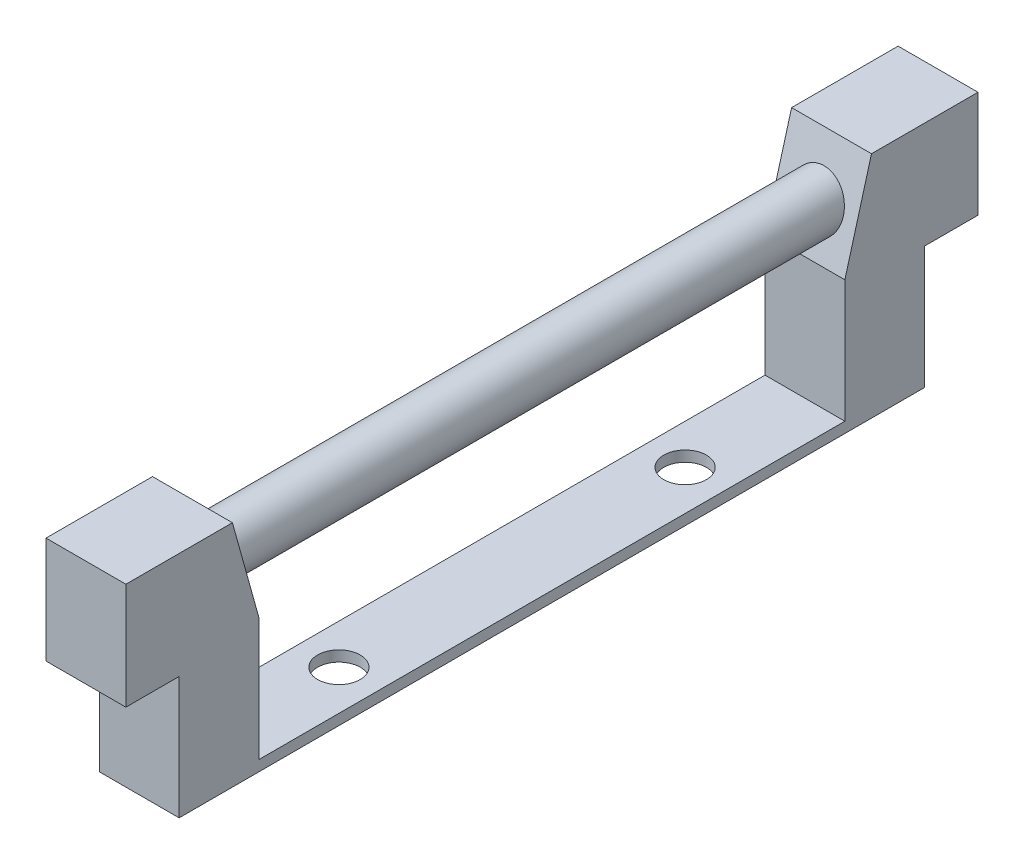
ISO-10303-21;
HEADER;
FILE_DESCRIPTION(('STEP AP214'),'2;1');
FILE_NAME('part.step','',(''),(''),'','','');
FILE_SCHEMA(('AUTOMOTIVE_DESIGN { 1 0 10303 214 1 1 1 1 }'));
ENDSEC;
DATA;
#1=APPLICATION_CONTEXT('core data for automotive mechanical design processes');
#2=APPLICATION_PROTOCOL_DEFINITION('international standard','automotive_design',2000,#1);
#3=PRODUCT_CONTEXT('',#1,'mechanical');
#4=PRODUCT('Part','Part','',(#3));
#5=PRODUCT_RELATED_PRODUCT_CATEGORY('part','',(#4));
#6=PRODUCT_DEFINITION_FORMATION('','',#4);
#7=PRODUCT_DEFINITION_CONTEXT('part definition',#1,'design');
#8=PRODUCT_DEFINITION('design','',#6,#7);
#9=PRODUCT_DEFINITION_SHAPE('','',#8);
#10=(LENGTH_UNIT() NAMED_UNIT(*) SI_UNIT(.MILLI.,.METRE.));
#11=(NAMED_UNIT(*) PLANE_ANGLE_UNIT() SI_UNIT($,.RADIAN.));
#12=(NAMED_UNIT(*) SI_UNIT($,.STERADIAN.) SOLID_ANGLE_UNIT());
#13=UNCERTAINTY_MEASURE_WITH_UNIT(LENGTH_MEASURE(1.E-05),#10,'distance_accuracy_value','');
#14=(GEOMETRIC_REPRESENTATION_CONTEXT(3) GLOBAL_UNCERTAINTY_ASSIGNED_CONTEXT((#13)) GLOBAL_UNIT_ASSIGNED_CONTEXT((#10,
#11,#12)) REPRESENTATION_CONTEXT('',''));
#15=CARTESIAN_POINT('',(0.,0.,0.));
#16=DIRECTION('',(0.,0.,1.));
#17=DIRECTION('',(1.,0.,0.));
#18=AXIS2_PLACEMENT_3D('',#15,#16,#17);
#19=CARTESIAN_POINT('',(-7.5,-43.,0.));
#20=DIRECTION('',(0.,-1.,0.));
#21=DIRECTION('',(0.,0.,-1.));
#22=AXIS2_PLACEMENT_3D('',#19,#20,#21);
#23=PLANE('',#22);
#24=CARTESIAN_POINT('',(0.,-43.,-32.5));
#25=DIRECTION('',(0.,-1.,0.));
#26=DIRECTION('',(0.,0.,-1.));
#27=AXIS2_PLACEMENT_3D('',#24,#25,#26);
#28=CIRCLE('',#27,4.);
#29=CARTESIAN_POINT('',(0.,-43.,-36.5));
#30=VERTEX_POINT('',#29);
#31=EDGE_CURVE('E356',#30,#30,#28,.T.);
#32=ORIENTED_EDGE('',*,*,#31,.F.);
#33=EDGE_LOOP('',(#32));
#34=FACE_BOUND('',#33,.T.);
#35=CARTESIAN_POINT('',(0.,-43.,32.5));
#36=DIRECTION('',(0.,-1.,0.));
#37=DIRECTION('',(0.,0.,-1.));
#38=AXIS2_PLACEMENT_3D('',#35,#36,#37);
#39=CIRCLE('',#38,4.);
#40=CARTESIAN_POINT('',(0.,-43.,28.5));
#41=VERTEX_POINT('',#40);
#42=EDGE_CURVE('E360',#41,#41,#39,.T.);
#43=ORIENTED_EDGE('',*,*,#42,.F.);
#44=EDGE_LOOP('',(#43));
#45=FACE_BOUND('',#44,.T.);
#46=DIRECTION('',(1.,0.,0.));
#47=VECTOR('',#46,1.);
#48=CARTESIAN_POINT('',(-7.5,-43.,-70.));
#49=LINE('',#48,#47);
#50=CARTESIAN_POINT('',(-7.5,-43.,-70.));
#51=VERTEX_POINT('',#50);
#52=CARTESIAN_POINT('',(7.5,-43.,-70.));
#53=VERTEX_POINT('',#52);
#54=EDGE_CURVE('E136',#51,#53,#49,.T.);
#55=ORIENTED_EDGE('',*,*,#54,.T.);
#56=DIRECTION('',(0.,0.,-1.));
#57=VECTOR('',#56,1.);
#58=CARTESIAN_POINT('',(7.5,-43.,0.));
#59=LINE('',#58,#57);
#60=CARTESIAN_POINT('',(7.5,-43.,70.));
#61=VERTEX_POINT('',#60);
#62=EDGE_CURVE('E138',#61,#53,#59,.T.);
#63=ORIENTED_EDGE('',*,*,#62,.F.);
#64=DIRECTION('',(1.,0.,0.));
#65=VECTOR('',#64,1.);
#66=CARTESIAN_POINT('',(-7.5,-43.,70.));
#67=LINE('',#66,#65);
#68=CARTESIAN_POINT('',(-7.5,-43.,70.));
#69=VERTEX_POINT('',#68);
#70=EDGE_CURVE('E44',#69,#61,#67,.T.);
#71=ORIENTED_EDGE('',*,*,#70,.F.);
#72=DIRECTION('',(0.,0.,-1.));
#73=VECTOR('',#72,1.);
#74=CARTESIAN_POINT('',(-7.5,-43.,0.));
#75=LINE('',#74,#73);
#76=EDGE_CURVE('E139',#69,#51,#75,.T.);
#77=ORIENTED_EDGE('',*,*,#76,.T.);
#78=EDGE_LOOP('',(#55,#63,#71,#77));
#79=FACE_BOUND('',#78,.T.);
#80=ADVANCED_FACE('F37',(#34,#45,#79),#23,.T.);
#81=CARTESIAN_POINT('',(-7.5,0.,70.));
#82=DIRECTION('',(0.,0.,1.));
#83=DIRECTION('',(1.,0.,0.));
#84=AXIS2_PLACEMENT_3D('',#81,#82,#83);
#85=PLANE('',#84);
#86=ORIENTED_EDGE('',*,*,#70,.T.);
#87=DIRECTION('',(0.,-1.,0.));
#88=VECTOR('',#87,1.);
#89=CARTESIAN_POINT('',(7.5,0.,70.));
#90=LINE('',#89,#88);
#91=CARTESIAN_POINT('',(7.5,-20.,70.));
#92=VERTEX_POINT('',#91);
#93=EDGE_CURVE('E153',#92,#61,#90,.T.);
#94=ORIENTED_EDGE('',*,*,#93,.F.);
#95=DIRECTION('',(1.,0.,0.));
#96=VECTOR('',#95,1.);
#97=CARTESIAN_POINT('',(-7.5,-20.,70.));
#98=LINE('',#97,#96);
#99=CARTESIAN_POINT('',(-7.5,-20.,70.));
#100=VERTEX_POINT('',#99);
#101=EDGE_CURVE('E58',#100,#92,#98,.T.);
#102=ORIENTED_EDGE('',*,*,#101,.F.);
#103=DIRECTION('',(0.,-1.,0.));
#104=VECTOR('',#103,1.);
#105=CARTESIAN_POINT('',(-7.5,0.,70.));
#106=LINE('',#105,#104);
#107=EDGE_CURVE('E144',#100,#69,#106,.T.);
#108=ORIENTED_EDGE('',*,*,#107,.T.);
#109=EDGE_LOOP('',(#86,#94,#102,#108));
#110=FACE_BOUND('',#109,.T.);
#111=ADVANCED_FACE('F296',(#110),#85,.T.);
#112=CARTESIAN_POINT('',(-7.5,-20.,0.));
#113=DIRECTION('',(0.,-1.,0.));
#114=DIRECTION('',(0.,0.,-1.));
#115=AXIS2_PLACEMENT_3D('',#112,#113,#114);
#116=PLANE('',#115);
#117=ORIENTED_EDGE('',*,*,#101,.T.);
#118=DIRECTION('',(0.,0.,-1.));
#119=VECTOR('',#118,1.);
#120=CARTESIAN_POINT('',(7.5,-20.,0.));
#121=LINE('',#120,#119);
#122=CARTESIAN_POINT('',(7.5,-20.,80.));
#123=VERTEX_POINT('',#122);
#124=EDGE_CURVE('E190',#123,#92,#121,.T.);
#125=ORIENTED_EDGE('',*,*,#124,.F.);
#126=DIRECTION('',(1.,0.,0.));
#127=VECTOR('',#126,1.);
#128=CARTESIAN_POINT('',(-7.5,-20.,80.));
#129=LINE('',#128,#127);
#130=CARTESIAN_POINT('',(-7.5,-20.,80.));
#131=VERTEX_POINT('',#130);
#132=EDGE_CURVE('E225',#131,#123,#129,.T.);
#133=ORIENTED_EDGE('',*,*,#132,.F.);
#134=DIRECTION('',(0.,0.,-1.));
#135=VECTOR('',#134,1.);
#136=CARTESIAN_POINT('',(-7.5,-20.,0.));
#137=LINE('',#136,#135);
#138=EDGE_CURVE('E220',#131,#100,#137,.T.);
#139=ORIENTED_EDGE('',*,*,#138,.T.);
#140=EDGE_LOOP('',(#117,#125,#133,#139));
#141=FACE_BOUND('',#140,.T.);
#142=ADVANCED_FACE('F295',(#141),#116,.T.);
#143=CARTESIAN_POINT('',(-7.5,0.,80.));
#144=DIRECTION('',(0.,0.,1.));
#145=DIRECTION('',(1.,0.,0.));
#146=AXIS2_PLACEMENT_3D('',#143,#144,#145);
#147=PLANE('',#146);
#148=ORIENTED_EDGE('',*,*,#132,.T.);
#149=DIRECTION('',(0.,-1.,0.));
#150=VECTOR('',#149,1.);
#151=CARTESIAN_POINT('',(7.5,0.,80.));
#152=LINE('',#151,#150);
#153=CARTESIAN_POINT('',(7.5,0.,80.));
#154=VERTEX_POINT('',#153);
#155=EDGE_CURVE('E187',#154,#123,#152,.T.);
#156=ORIENTED_EDGE('',*,*,#155,.F.);
#157=DIRECTION('',(1.,0.,0.));
#158=VECTOR('',#157,1.);
#159=CARTESIAN_POINT('',(-7.5,0.,80.));
#160=LINE('',#159,#158);
#161=CARTESIAN_POINT('',(-7.5,0.,80.));
#162=VERTEX_POINT('',#161);
#163=EDGE_CURVE('E227',#162,#154,#160,.T.);
#164=ORIENTED_EDGE('',*,*,#163,.F.);
#165=DIRECTION('',(0.,-1.,0.));
#166=VECTOR('',#165,1.);
#167=CARTESIAN_POINT('',(-7.5,0.,80.));
#168=LINE('',#167,#166);
#169=EDGE_CURVE('E217',#162,#131,#168,.T.);
#170=ORIENTED_EDGE('',*,*,#169,.T.);
#171=EDGE_LOOP('',(#148,#156,#164,#170));
#172=FACE_BOUND('',#171,.T.);
#173=ADVANCED_FACE('F291',(#172),#147,.T.);
#174=CARTESIAN_POINT('',(-7.5,0.,0.));
#175=DIRECTION('',(0.,1.,0.));
#176=DIRECTION('',(0.,0.,1.));
#177=AXIS2_PLACEMENT_3D('',#174,#175,#176);
#178=PLANE('',#177);
#179=ORIENTED_EDGE('',*,*,#163,.T.);
#180=DIRECTION('',(0.,0.,1.));
#181=VECTOR('',#180,1.);
#182=CARTESIAN_POINT('',(7.5,0.,0.));
#183=LINE('',#182,#181);
#184=CARTESIAN_POINT('',(7.5,0.,60.));
#185=VERTEX_POINT('',#184);
#186=EDGE_CURVE('E184',#185,#154,#183,.T.);
#187=ORIENTED_EDGE('',*,*,#186,.F.);
#188=DIRECTION('',(1.,0.,0.));
#189=VECTOR('',#188,1.);
#190=CARTESIAN_POINT('',(-7.5,0.,60.));
#191=LINE('',#190,#189);
#192=CARTESIAN_POINT('',(-7.5,0.,60.));
#193=VERTEX_POINT('',#192);
#194=EDGE_CURVE('E229',#193,#185,#191,.T.);
#195=ORIENTED_EDGE('',*,*,#194,.F.);
#196=DIRECTION('',(0.,0.,1.));
#197=VECTOR('',#196,1.);
#198=CARTESIAN_POINT('',(-7.5,0.,0.));
#199=LINE('',#198,#197);
#200=EDGE_CURVE('E214',#193,#162,#199,.T.);
#201=ORIENTED_EDGE('',*,*,#200,.T.);
#202=EDGE_LOOP('',(#179,#187,#195,#201));
#203=FACE_BOUND('',#202,.T.);
#204=ADVANCED_FACE('F284',(#203),#178,.T.);
#205=CARTESIAN_POINT('',(-7.5,-15.4727793696275,55.702005730659));
#206=DIRECTION('',(0.,0.267643863786094,-0.963517909629941));
#207=DIRECTION('',(0.,0.963517909629941,0.267643863786094));
#208=AXIS2_PLACEMENT_3D('',#205,#206,#207);
#209=PLANE('',#208);
#210=CARTESIAN_POINT('',(0.,-10.,57.2222222222222));
#211=DIRECTION('',(0.,0.267643863786094,-0.963517909629941));
#212=DIRECTION('',(0.,-0.963517909629941,-0.267643863786094));
#213=AXIS2_PLACEMENT_3D('',#210,#211,#212);
#214=ELLIPSE('',#213,5.1893171367415,5.);
#215=CARTESIAN_POINT('',(0.,-15.,55.8333333333333));
#216=VERTEX_POINT('',#215);
#217=EDGE_CURVE('E154',#216,#216,#214,.F.);
#218=ORIENTED_EDGE('',*,*,#217,.T.);
#219=EDGE_LOOP('',(#218));
#220=FACE_BOUND('',#219,.T.);
#221=ORIENTED_EDGE('',*,*,#194,.T.);
#222=DIRECTION('',(0.,0.963517909629941,0.267643863786094));
#223=VECTOR('',#222,1.);
#224=CARTESIAN_POINT('',(7.5,-15.4727793696275,55.702005730659));
#225=LINE('',#224,#223);
#226=CARTESIAN_POINT('',(7.5,-18.,55.));
#227=VERTEX_POINT('',#226);
#228=EDGE_CURVE('E181',#227,#185,#225,.T.);
#229=ORIENTED_EDGE('',*,*,#228,.F.);
#230=DIRECTION('',(1.,0.,0.));
#231=VECTOR('',#230,1.);
#232=CARTESIAN_POINT('',(-7.5,-18.,55.));
#233=LINE('',#232,#231);
#234=CARTESIAN_POINT('',(-7.5,-18.,55.));
#235=VERTEX_POINT('',#234);
#236=EDGE_CURVE('E231',#235,#227,#233,.T.);
#237=ORIENTED_EDGE('',*,*,#236,.F.);
#238=DIRECTION('',(0.,0.963517909629941,0.267643863786094));
#239=VECTOR('',#238,1.);
#240=CARTESIAN_POINT('',(-7.5,-15.4727793696275,55.702005730659));
#241=LINE('',#240,#239);
#242=EDGE_CURVE('E211',#235,#193,#241,.T.);
#243=ORIENTED_EDGE('',*,*,#242,.T.);
#244=EDGE_LOOP('',(#221,#229,#237,#243));
#245=FACE_BOUND('',#244,.T.);
#246=ADVANCED_FACE('F280',(#220,#245),#209,.T.);
#247=CARTESIAN_POINT('',(-7.5,0.,55.));
#248=DIRECTION('',(0.,0.,-1.));
#249=DIRECTION('',(-1.,0.,0.));
#250=AXIS2_PLACEMENT_3D('',#247,#248,#249);
#251=PLANE('',#250);
#252=ORIENTED_EDGE('',*,*,#236,.T.);
#253=DIRECTION('',(0.,1.,0.));
#254=VECTOR('',#253,1.);
#255=CARTESIAN_POINT('',(7.5,0.,55.));
#256=LINE('',#255,#254);
#257=CARTESIAN_POINT('',(7.5,-41.,55.));
#258=VERTEX_POINT('',#257);
#259=EDGE_CURVE('E178',#258,#227,#256,.T.);
#260=ORIENTED_EDGE('',*,*,#259,.F.);
#261=DIRECTION('',(1.,0.,0.));
#262=VECTOR('',#261,1.);
#263=CARTESIAN_POINT('',(-7.5,-41.,55.));
#264=LINE('',#263,#262);
#265=CARTESIAN_POINT('',(-7.5,-41.,55.));
#266=VERTEX_POINT('',#265);
#267=EDGE_CURVE('E233',#266,#258,#264,.T.);
#268=ORIENTED_EDGE('',*,*,#267,.F.);
#269=DIRECTION('',(0.,1.,0.));
#270=VECTOR('',#269,1.);
#271=CARTESIAN_POINT('',(-7.5,0.,55.));
#272=LINE('',#271,#270);
#273=EDGE_CURVE('E208',#266,#235,#272,.T.);
#274=ORIENTED_EDGE('',*,*,#273,.T.);
#275=EDGE_LOOP('',(#252,#260,#268,#274));
#276=FACE_BOUND('',#275,.T.);
#277=ADVANCED_FACE('F276',(#276),#251,.T.);
#278=CARTESIAN_POINT('',(-7.5,-41.,0.));
#279=DIRECTION('',(0.,-1.,0.));
#280=DIRECTION('',(0.,0.,-1.));
#281=AXIS2_PLACEMENT_3D('',#278,#279,#280);
#282=PLANE('',#281);
#283=CARTESIAN_POINT('',(0.,-41.,-32.5));
#284=DIRECTION('',(0.,1.,0.));
#285=DIRECTION('',(0.,0.,1.));
#286=AXIS2_PLACEMENT_3D('',#283,#284,#285);
#287=CIRCLE('',#286,4.);
#288=CARTESIAN_POINT('',(0.,-41.,-28.5));
#289=VERTEX_POINT('',#288);
#290=EDGE_CURVE('E359',#289,#289,#287,.T.);
#291=ORIENTED_EDGE('',*,*,#290,.F.);
#292=EDGE_LOOP('',(#291));
#293=FACE_BOUND('',#292,.T.);
#294=CARTESIAN_POINT('',(0.,-41.,32.5));
#295=DIRECTION('',(0.,1.,0.));
#296=DIRECTION('',(0.,0.,1.));
#297=AXIS2_PLACEMENT_3D('',#294,#295,#296);
#298=CIRCLE('',#297,4.);
#299=CARTESIAN_POINT('',(0.,-41.,36.5));
#300=VERTEX_POINT('',#299);
#301=EDGE_CURVE('E361',#300,#300,#298,.T.);
#302=ORIENTED_EDGE('',*,*,#301,.F.);
#303=EDGE_LOOP('',(#302));
#304=FACE_BOUND('',#303,.T.);
#305=ORIENTED_EDGE('',*,*,#267,.T.);
#306=DIRECTION('',(0.,0.,-1.));
#307=VECTOR('',#306,1.);
#308=CARTESIAN_POINT('',(7.5,-41.,0.));
#309=LINE('',#308,#307);
#310=CARTESIAN_POINT('',(7.5,-41.,-55.));
#311=VERTEX_POINT('',#310);
#312=EDGE_CURVE('E175',#258,#311,#309,.T.);
#313=ORIENTED_EDGE('',*,*,#312,.T.);
#314=DIRECTION('',(1.,0.,0.));
#315=VECTOR('',#314,1.);
#316=CARTESIAN_POINT('',(-7.5,-41.,-55.));
#317=LINE('',#316,#315);
#318=CARTESIAN_POINT('',(-7.5,-41.,-55.));
#319=VERTEX_POINT('',#318);
#320=EDGE_CURVE('E235',#319,#311,#317,.T.);
#321=ORIENTED_EDGE('',*,*,#320,.F.);
#322=DIRECTION('',(0.,0.,-1.));
#323=VECTOR('',#322,1.);
#324=CARTESIAN_POINT('',(-7.5,-41.,0.));
#325=LINE('',#324,#323);
#326=EDGE_CURVE('E206',#266,#319,#325,.T.);
#327=ORIENTED_EDGE('',*,*,#326,.F.);
#328=EDGE_LOOP('',(#305,#313,#321,#327));
#329=FACE_BOUND('',#328,.T.);
#330=ADVANCED_FACE('F271',(#293,#304,#329),#282,.F.);
#331=CARTESIAN_POINT('',(-7.5,0.,-55.));
#332=DIRECTION('',(0.,0.,-1.));
#333=DIRECTION('',(0.,1.,0.));
#334=AXIS2_PLACEMENT_3D('',#331,#332,#333);
#335=PLANE('',#334);
#336=ORIENTED_EDGE('',*,*,#320,.T.);
#337=DIRECTION('',(0.,1.,0.));
#338=VECTOR('',#337,1.);
#339=CARTESIAN_POINT('',(7.5,0.,-55.));
#340=LINE('',#339,#338);
#341=CARTESIAN_POINT('',(7.5,-18.,-55.));
#342=VERTEX_POINT('',#341);
#343=EDGE_CURVE('E172',#311,#342,#340,.T.);
#344=ORIENTED_EDGE('',*,*,#343,.T.);
#345=DIRECTION('',(1.,0.,0.));
#346=VECTOR('',#345,1.);
#347=CARTESIAN_POINT('',(-7.5,-18.,-55.));
#348=LINE('',#347,#346);
#349=CARTESIAN_POINT('',(-7.5,-18.,-55.));
#350=VERTEX_POINT('',#349);
#351=EDGE_CURVE('E237',#350,#342,#348,.T.);
#352=ORIENTED_EDGE('',*,*,#351,.F.);
#353=DIRECTION('',(0.,1.,0.));
#354=VECTOR('',#353,1.);
#355=CARTESIAN_POINT('',(-7.5,0.,-55.));
#356=LINE('',#355,#354);
#357=EDGE_CURVE('E204',#319,#350,#356,.T.);
#358=ORIENTED_EDGE('',*,*,#357,.F.);
#359=EDGE_LOOP('',(#336,#344,#352,#358));
#360=FACE_BOUND('',#359,.T.);
#361=ADVANCED_FACE('F267',(#360),#335,.F.);
#362=CARTESIAN_POINT('',(-7.5,-15.4727793696275,-55.702005730659));
#363=DIRECTION('',(0.,-0.267643863786094,-0.963517909629941));
#364=DIRECTION('',(0.,0.963517909629941,-0.267643863786094));
#365=AXIS2_PLACEMENT_3D('',#362,#363,#364);
#366=PLANE('',#365);
#367=CARTESIAN_POINT('',(0.,-10.,-57.2222222222222));
#368=DIRECTION('',(0.,-0.267643863786094,-0.963517909629941));
#369=DIRECTION('',(0.,0.963517909629941,-0.267643863786094));
#370=AXIS2_PLACEMENT_3D('',#367,#368,#369);
#371=ELLIPSE('',#370,5.1893171367415,5.);
#372=CARTESIAN_POINT('',(0.,-5.,-58.6111111111111));
#373=VERTEX_POINT('',#372);
#374=EDGE_CURVE('E11',#373,#373,#371,.F.);
#375=ORIENTED_EDGE('',*,*,#374,.F.);
#376=EDGE_LOOP('',(#375));
#377=FACE_BOUND('',#376,.T.);
#378=ORIENTED_EDGE('',*,*,#351,.T.);
#379=DIRECTION('',(0.,0.963517909629941,-0.267643863786094));
#380=VECTOR('',#379,1.);
#381=CARTESIAN_POINT('',(7.5,-15.4727793696275,-55.702005730659));
#382=LINE('',#381,#380);
#383=CARTESIAN_POINT('',(7.5,0.,-60.));
#384=VERTEX_POINT('',#383);
#385=EDGE_CURVE('E169',#342,#384,#382,.T.);
#386=ORIENTED_EDGE('',*,*,#385,.T.);
#387=DIRECTION('',(1.,0.,0.));
#388=VECTOR('',#387,1.);
#389=CARTESIAN_POINT('',(-7.5,0.,-60.));
#390=LINE('',#389,#388);
#391=CARTESIAN_POINT('',(-7.5,0.,-60.));
#392=VERTEX_POINT('',#391);
#393=EDGE_CURVE('E239',#392,#384,#390,.T.);
#394=ORIENTED_EDGE('',*,*,#393,.F.);
#395=DIRECTION('',(0.,0.963517909629941,-0.267643863786094));
#396=VECTOR('',#395,1.);
#397=CARTESIAN_POINT('',(-7.5,-15.4727793696275,-55.702005730659));
#398=LINE('',#397,#396);
#399=EDGE_CURVE('E202',#350,#392,#398,.T.);
#400=ORIENTED_EDGE('',*,*,#399,.F.);
#401=EDGE_LOOP('',(#378,#386,#394,#400));
#402=FACE_BOUND('',#401,.T.);
#403=ADVANCED_FACE('F262',(#377,#402),#366,.F.);
#404=CARTESIAN_POINT('',(-7.5,0.,0.));
#405=DIRECTION('',(0.,-1.,0.));
#406=DIRECTION('',(0.,0.,-1.));
#407=AXIS2_PLACEMENT_3D('',#404,#405,#406);
#408=PLANE('',#407);
#409=ORIENTED_EDGE('',*,*,#393,.T.);
#410=DIRECTION('',(0.,0.,-1.));
#411=VECTOR('',#410,1.);
#412=CARTESIAN_POINT('',(7.5,0.,0.));
#413=LINE('',#412,#411);
#414=CARTESIAN_POINT('',(7.5,0.,-80.));
#415=VERTEX_POINT('',#414);
#416=EDGE_CURVE('E166',#384,#415,#413,.T.);
#417=ORIENTED_EDGE('',*,*,#416,.T.);
#418=DIRECTION('',(1.,0.,0.));
#419=VECTOR('',#418,1.);
#420=CARTESIAN_POINT('',(-7.5,0.,-80.));
#421=LINE('',#420,#419);
#422=CARTESIAN_POINT('',(-7.5,0.,-80.));
#423=VERTEX_POINT('',#422);
#424=EDGE_CURVE('E241',#423,#415,#421,.T.);
#425=ORIENTED_EDGE('',*,*,#424,.F.);
#426=DIRECTION('',(0.,0.,-1.));
#427=VECTOR('',#426,1.);
#428=CARTESIAN_POINT('',(-7.5,0.,0.));
#429=LINE('',#428,#427);
#430=EDGE_CURVE('E200',#392,#423,#429,.T.);
#431=ORIENTED_EDGE('',*,*,#430,.F.);
#432=EDGE_LOOP('',(#409,#417,#425,#431));
#433=FACE_BOUND('',#432,.T.);
#434=ADVANCED_FACE('F257',(#433),#408,.F.);
#435=CARTESIAN_POINT('',(-7.5,0.,-80.));
#436=DIRECTION('',(0.,0.,1.));
#437=DIRECTION('',(1.,0.,0.));
#438=AXIS2_PLACEMENT_3D('',#435,#436,#437);
#439=PLANE('',#438);
#440=ORIENTED_EDGE('',*,*,#424,.T.);
#441=DIRECTION('',(0.,-1.,0.));
#442=VECTOR('',#441,1.);
#443=CARTESIAN_POINT('',(7.5,0.,-80.));
#444=LINE('',#443,#442);
#445=CARTESIAN_POINT('',(7.5,-20.,-80.));
#446=VERTEX_POINT('',#445);
#447=EDGE_CURVE('E160',#415,#446,#444,.T.);
#448=ORIENTED_EDGE('',*,*,#447,.T.);
#449=DIRECTION('',(1.,0.,0.));
#450=VECTOR('',#449,1.);
#451=CARTESIAN_POINT('',(-7.5,-20.,-80.));
#452=LINE('',#451,#450);
#453=CARTESIAN_POINT('',(-7.5,-20.,-80.));
#454=VERTEX_POINT('',#453);
#455=EDGE_CURVE('E243',#454,#446,#452,.T.);
#456=ORIENTED_EDGE('',*,*,#455,.F.);
#457=DIRECTION('',(0.,-1.,0.));
#458=VECTOR('',#457,1.);
#459=CARTESIAN_POINT('',(-7.5,0.,-80.));
#460=LINE('',#459,#458);
#461=EDGE_CURVE('E198',#423,#454,#460,.T.);
#462=ORIENTED_EDGE('',*,*,#461,.F.);
#463=EDGE_LOOP('',(#440,#448,#456,#462));
#464=FACE_BOUND('',#463,.T.);
#465=ADVANCED_FACE('F253',(#464),#439,.F.);
#466=CARTESIAN_POINT('',(-7.5,-20.,0.));
#467=DIRECTION('',(0.,1.,0.));
#468=DIRECTION('',(0.,0.,1.));
#469=AXIS2_PLACEMENT_3D('',#466,#467,#468);
#470=PLANE('',#469);
#471=ORIENTED_EDGE('',*,*,#455,.T.);
#472=DIRECTION('',(0.,0.,1.));
#473=VECTOR('',#472,1.);
#474=CARTESIAN_POINT('',(7.5,-20.,0.));
#475=LINE('',#474,#473);
#476=CARTESIAN_POINT('',(7.5,-20.,-70.));
#477=VERTEX_POINT('',#476);
#478=EDGE_CURVE('E158',#446,#477,#475,.T.);
#479=ORIENTED_EDGE('',*,*,#478,.T.);
#480=DIRECTION('',(1.,0.,0.));
#481=VECTOR('',#480,1.);
#482=CARTESIAN_POINT('',(-7.5,-20.,-70.));
#483=LINE('',#482,#481);
#484=CARTESIAN_POINT('',(-7.5,-20.,-70.));
#485=VERTEX_POINT('',#484);
#486=EDGE_CURVE('E143',#485,#477,#483,.T.);
#487=ORIENTED_EDGE('',*,*,#486,.F.);
#488=DIRECTION('',(0.,0.,1.));
#489=VECTOR('',#488,1.);
#490=CARTESIAN_POINT('',(-7.5,-20.,0.));
#491=LINE('',#490,#489);
#492=EDGE_CURVE('E196',#454,#485,#491,.T.);
#493=ORIENTED_EDGE('',*,*,#492,.F.);
#494=EDGE_LOOP('',(#471,#479,#487,#493));
#495=FACE_BOUND('',#494,.T.);
#496=ADVANCED_FACE('F248',(#495),#470,.F.);
#497=CARTESIAN_POINT('',(-7.5,0.,-70.));
#498=DIRECTION('',(0.,0.,1.));
#499=DIRECTION('',(1.,0.,0.));
#500=AXIS2_PLACEMENT_3D('',#497,#498,#499);
#501=PLANE('',#500);
#502=ORIENTED_EDGE('',*,*,#486,.T.);
#503=DIRECTION('',(0.,-1.,0.));
#504=VECTOR('',#503,1.);
#505=CARTESIAN_POINT('',(7.5,0.,-70.));
#506=LINE('',#505,#504);
#507=EDGE_CURVE('E150',#477,#53,#506,.T.);
#508=ORIENTED_EDGE('',*,*,#507,.T.);
#509=ORIENTED_EDGE('',*,*,#54,.F.);
#510=DIRECTION('',(0.,-1.,0.));
#511=VECTOR('',#510,1.);
#512=CARTESIAN_POINT('',(-7.5,0.,-70.));
#513=LINE('',#512,#511);
#514=EDGE_CURVE('E194',#485,#51,#513,.T.);
#515=ORIENTED_EDGE('',*,*,#514,.F.);
#516=EDGE_LOOP('',(#502,#508,#509,#515));
#517=FACE_BOUND('',#516,.T.);
#518=ADVANCED_FACE('F156',(#517),#501,.F.);
#519=CARTESIAN_POINT('',(-7.5,0.,0.));
#520=DIRECTION('',(1.,0.,0.));
#521=DIRECTION('',(0.,0.,-1.));
#522=AXIS2_PLACEMENT_3D('',#519,#520,#521);
#523=PLANE('',#522);
#524=ORIENTED_EDGE('',*,*,#76,.F.);
#525=ORIENTED_EDGE('',*,*,#107,.F.);
#526=ORIENTED_EDGE('',*,*,#138,.F.);
#527=ORIENTED_EDGE('',*,*,#169,.F.);
#528=ORIENTED_EDGE('',*,*,#200,.F.);
#529=ORIENTED_EDGE('',*,*,#242,.F.);
#530=ORIENTED_EDGE('',*,*,#273,.F.);
#531=ORIENTED_EDGE('',*,*,#326,.T.);
#532=ORIENTED_EDGE('',*,*,#357,.T.);
#533=ORIENTED_EDGE('',*,*,#399,.T.);
#534=ORIENTED_EDGE('',*,*,#430,.T.);
#535=ORIENTED_EDGE('',*,*,#461,.T.);
#536=ORIENTED_EDGE('',*,*,#492,.T.);
#537=ORIENTED_EDGE('',*,*,#514,.T.);
#538=EDGE_LOOP('',(#524,#525,#526,#527,#528,#529,#530,#531,#532,#533,#534,#535,#536,#537));
#539=FACE_BOUND('',#538,.T.);
#540=ADVANCED_FACE('F287',(#539),#523,.F.);
#541=CARTESIAN_POINT('',(7.5,0.,0.));
#542=DIRECTION('',(1.,0.,0.));
#543=DIRECTION('',(0.,0.,-1.));
#544=AXIS2_PLACEMENT_3D('',#541,#542,#543);
#545=PLANE('',#544);
#546=ORIENTED_EDGE('',*,*,#62,.T.);
#547=ORIENTED_EDGE('',*,*,#507,.F.);
#548=ORIENTED_EDGE('',*,*,#478,.F.);
#549=ORIENTED_EDGE('',*,*,#447,.F.);
#550=ORIENTED_EDGE('',*,*,#416,.F.);
#551=ORIENTED_EDGE('',*,*,#385,.F.);
#552=ORIENTED_EDGE('',*,*,#343,.F.);
#553=ORIENTED_EDGE('',*,*,#312,.F.);
#554=ORIENTED_EDGE('',*,*,#259,.T.);
#555=ORIENTED_EDGE('',*,*,#228,.T.);
#556=ORIENTED_EDGE('',*,*,#186,.T.);
#557=ORIENTED_EDGE('',*,*,#155,.T.);
#558=ORIENTED_EDGE('',*,*,#124,.T.);
#559=ORIENTED_EDGE('',*,*,#93,.T.);
#560=EDGE_LOOP('',(#546,#547,#548,#549,#550,#551,#552,#553,#554,#555,#556,#557,#558,#559));
#561=FACE_BOUND('',#560,.T.);
#562=ADVANCED_FACE('F148',(#561),#545,.T.);
#563=CARTESIAN_POINT('',(0.,-10.,60.));
#564=DIRECTION('',(0.,0.,-1.));
#565=DIRECTION('',(-1.,0.,0.));
#566=AXIS2_PLACEMENT_3D('',#563,#564,#565);
#567=CYLINDRICAL_SURFACE('',#566,5.);
#568=ORIENTED_EDGE('',*,*,#217,.F.);
#569=EDGE_LOOP('',(#568));
#570=FACE_BOUND('',#569,.T.);
#571=ORIENTED_EDGE('',*,*,#374,.T.);
#572=EDGE_LOOP('',(#571));
#573=FACE_BOUND('',#572,.T.);
#574=ADVANCED_FACE('F337',(#570,#573),#567,.T.);
#575=CARTESIAN_POINT('',(0.,-101.,32.5));
#576=DIRECTION('',(0.,1.,0.));
#577=DIRECTION('',(0.,0.,1.));
#578=AXIS2_PLACEMENT_3D('',#575,#576,#577);
#579=CYLINDRICAL_SURFACE('',#578,4.);
#580=ORIENTED_EDGE('',*,*,#42,.T.);
#581=EDGE_LOOP('',(#580));
#582=FACE_BOUND('',#581,.T.);
#583=ORIENTED_EDGE('',*,*,#301,.T.);
#584=EDGE_LOOP('',(#583));
#585=FACE_BOUND('',#584,.T.);
#586=ADVANCED_FACE('F341',(#582,#585),#579,.F.);
#587=CARTESIAN_POINT('',(0.,-101.,-32.5));
#588=DIRECTION('',(0.,1.,0.));
#589=DIRECTION('',(0.,0.,1.));
#590=AXIS2_PLACEMENT_3D('',#587,#588,#589);
#591=CYLINDRICAL_SURFACE('',#590,4.);
#592=ORIENTED_EDGE('',*,*,#31,.T.);
#593=EDGE_LOOP('',(#592));
#594=FACE_BOUND('',#593,.T.);
#595=ORIENTED_EDGE('',*,*,#290,.T.);
#596=EDGE_LOOP('',(#595));
#597=FACE_BOUND('',#596,.T.);
#598=ADVANCED_FACE('F347',(#594,#597),#591,.F.);
#599=CLOSED_SHELL('',(#80,#111,#142,#173,#204,#246,#277,#330,#361,#403,#434,#465,#496,#518,#540,
#562,#574,#586,#598));
#600=MANIFOLD_SOLID_BREP('B2',#599);
#601=ADVANCED_BREP_SHAPE_REPRESENTATION('',(#18,#600),#14);
#602=SHAPE_DEFINITION_REPRESENTATION(#9,#601);
ENDSEC;
END-ISO-10303-21;
